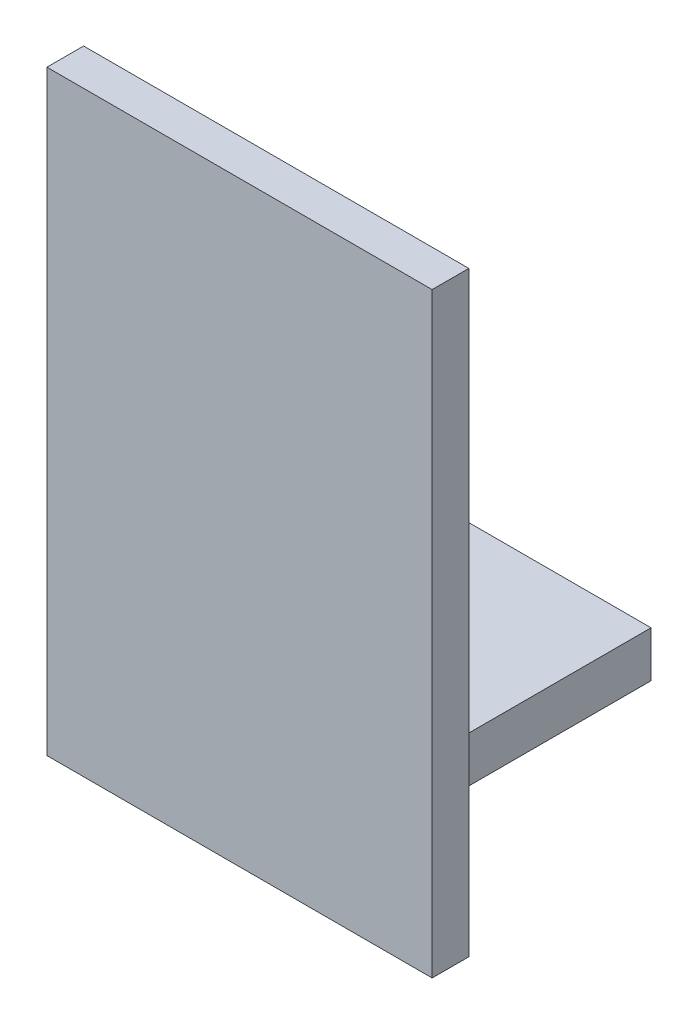
ISO-10303-21;
HEADER;
FILE_DESCRIPTION(('STEP AP214'),'2;1');
FILE_NAME('part.step','',(''),(''),'','','');
FILE_SCHEMA(('AUTOMOTIVE_DESIGN { 1 0 10303 214 1 1 1 1 }'));
ENDSEC;
DATA;
#1=APPLICATION_CONTEXT('core data for automotive mechanical design processes');
#2=APPLICATION_PROTOCOL_DEFINITION('international standard','automotive_design',2000,#1);
#3=PRODUCT_CONTEXT('',#1,'mechanical');
#4=PRODUCT('Part','Part','',(#3));
#5=PRODUCT_RELATED_PRODUCT_CATEGORY('part','',(#4));
#6=PRODUCT_DEFINITION_FORMATION('','',#4);
#7=PRODUCT_DEFINITION_CONTEXT('part definition',#1,'design');
#8=PRODUCT_DEFINITION('design','',#6,#7);
#9=PRODUCT_DEFINITION_SHAPE('','',#8);
#10=(LENGTH_UNIT() NAMED_UNIT(*) SI_UNIT(.MILLI.,.METRE.));
#11=(NAMED_UNIT(*) PLANE_ANGLE_UNIT() SI_UNIT($,.RADIAN.));
#12=(NAMED_UNIT(*) SI_UNIT($,.STERADIAN.) SOLID_ANGLE_UNIT());
#13=UNCERTAINTY_MEASURE_WITH_UNIT(LENGTH_MEASURE(1.E-05),#10,'distance_accuracy_value','');
#14=(GEOMETRIC_REPRESENTATION_CONTEXT(3) GLOBAL_UNCERTAINTY_ASSIGNED_CONTEXT((#13)) GLOBAL_UNIT_ASSIGNED_CONTEXT((#10,
#11,#12)) REPRESENTATION_CONTEXT('',''));
#15=CARTESIAN_POINT('',(0.,0.,0.));
#16=DIRECTION('',(0.,0.,1.));
#17=DIRECTION('',(1.,0.,0.));
#18=AXIS2_PLACEMENT_3D('',#15,#16,#17);
#19=CARTESIAN_POINT('',(-42.,0.,0.));
#20=DIRECTION('',(0.,1.,0.));
#21=DIRECTION('',(0.,0.,1.));
#22=AXIS2_PLACEMENT_3D('',#19,#20,#21);
#23=PLANE('',#22);
#24=DIRECTION('',(0.,0.,1.));
#25=VECTOR('',#24,1.);
#26=CARTESIAN_POINT('',(-16.132543853731,0.,-36.3744901061168));
#27=LINE('',#26,#25);
#28=CARTESIAN_POINT('',(-16.132543853731,0.,-36.));
#29=VERTEX_POINT('',#28);
#30=CARTESIAN_POINT('',(-16.132543853731,0.,0.));
#31=VERTEX_POINT('',#30);
#32=EDGE_CURVE('E132',#29,#31,#27,.T.);
#33=ORIENTED_EDGE('',*,*,#32,.F.);
#34=DIRECTION('',(1.,0.,0.));
#35=VECTOR('',#34,1.);
#36=CARTESIAN_POINT('',(-42.,0.,-36.));
#37=LINE('',#36,#35);
#38=CARTESIAN_POINT('',(-42.,0.,-36.));
#39=VERTEX_POINT('',#38);
#40=EDGE_CURVE('E11',#39,#29,#37,.T.);
#41=ORIENTED_EDGE('',*,*,#40,.F.);
#42=DIRECTION('',(0.,0.,1.));
#43=VECTOR('',#42,1.);
#44=CARTESIAN_POINT('',(-42.,0.,0.));
#45=LINE('',#44,#43);
#46=CARTESIAN_POINT('',(-42.,0.,0.));
#47=VERTEX_POINT('',#46);
#48=EDGE_CURVE('E124',#39,#47,#45,.T.);
#49=ORIENTED_EDGE('',*,*,#48,.T.);
#50=DIRECTION('',(1.,0.,0.));
#51=VECTOR('',#50,1.);
#52=CARTESIAN_POINT('',(-42.,0.,0.));
#53=LINE('',#52,#51);
#54=EDGE_CURVE('E35',#47,#31,#53,.T.);
#55=ORIENTED_EDGE('',*,*,#54,.T.);
#56=EDGE_LOOP('',(#33,#41,#49,#55));
#57=FACE_BOUND('',#56,.T.);
#58=ADVANCED_FACE('F32',(#57),#23,.T.);
#59=CARTESIAN_POINT('',(-42.,0.,-36.));
#60=DIRECTION('',(0.,0.,-1.));
#61=DIRECTION('',(-1.,0.,0.));
#62=AXIS2_PLACEMENT_3D('',#59,#60,#61);
#63=PLANE('',#62);
#64=DIRECTION('',(0.,1.,0.));
#65=VECTOR('',#64,1.);
#66=CARTESIAN_POINT('',(-16.132543853731,0.,-36.));
#67=LINE('',#66,#65);
#68=CARTESIAN_POINT('',(-16.132543853731,-5.,-36.));
#69=VERTEX_POINT('',#68);
#70=EDGE_CURVE('E119',#69,#29,#67,.T.);
#71=ORIENTED_EDGE('',*,*,#70,.F.);
#72=DIRECTION('',(1.,0.,0.));
#73=VECTOR('',#72,1.);
#74=CARTESIAN_POINT('',(-42.,-5.,-36.));
#75=LINE('',#74,#73);
#76=CARTESIAN_POINT('',(-42.,-5.,-36.));
#77=VERTEX_POINT('',#76);
#78=EDGE_CURVE('E41',#77,#69,#75,.T.);
#79=ORIENTED_EDGE('',*,*,#78,.F.);
#80=DIRECTION('',(0.,1.,0.));
#81=VECTOR('',#80,1.);
#82=CARTESIAN_POINT('',(-42.,0.,-36.));
#83=LINE('',#82,#81);
#84=EDGE_CURVE('E105',#77,#39,#83,.T.);
#85=ORIENTED_EDGE('',*,*,#84,.T.);
#86=ORIENTED_EDGE('',*,*,#40,.T.);
#87=EDGE_LOOP('',(#71,#79,#85,#86));
#88=FACE_BOUND('',#87,.T.);
#89=ADVANCED_FACE('F160',(#88),#63,.T.);
#90=CARTESIAN_POINT('',(-42.,-5.,-36.));
#91=DIRECTION('',(0.,-1.,0.));
#92=DIRECTION('',(0.,0.,-1.));
#93=AXIS2_PLACEMENT_3D('',#90,#91,#92);
#94=PLANE('',#93);
#95=DIRECTION('',(1.,0.,0.));
#96=VECTOR('',#95,1.);
#97=CARTESIAN_POINT('',(-16.132543853731,-5.,0.));
#98=LINE('',#97,#96);
#99=CARTESIAN_POINT('',(-16.132543853731,-5.,0.));
#100=VERTEX_POINT('',#99);
#101=CARTESIAN_POINT('',(0.,-5.,0.));
#102=VERTEX_POINT('',#101);
#103=EDGE_CURVE('E145',#100,#102,#98,.T.);
#104=ORIENTED_EDGE('',*,*,#103,.T.);
#105=DIRECTION('',(0.,0.,-1.));
#106=VECTOR('',#105,1.);
#107=CARTESIAN_POINT('',(0.,-5.,-36.));
#108=LINE('',#107,#106);
#109=CARTESIAN_POINT('',(0.,-5.,4.));
#110=VERTEX_POINT('',#109);
#111=EDGE_CURVE('E96',#110,#102,#108,.T.);
#112=ORIENTED_EDGE('',*,*,#111,.F.);
#113=DIRECTION('',(1.,0.,0.));
#114=VECTOR('',#113,1.);
#115=CARTESIAN_POINT('',(-42.,-5.,4.));
#116=LINE('',#115,#114);
#117=CARTESIAN_POINT('',(-42.,-5.,4.));
#118=VERTEX_POINT('',#117);
#119=EDGE_CURVE('E71',#118,#110,#116,.T.);
#120=ORIENTED_EDGE('',*,*,#119,.F.);
#121=DIRECTION('',(0.,0.,-1.));
#122=VECTOR('',#121,1.);
#123=CARTESIAN_POINT('',(-42.,-5.,-36.));
#124=LINE('',#123,#122);
#125=EDGE_CURVE('E93',#118,#77,#124,.T.);
#126=ORIENTED_EDGE('',*,*,#125,.T.);
#127=ORIENTED_EDGE('',*,*,#78,.T.);
#128=DIRECTION('',(0.,0.,1.));
#129=VECTOR('',#128,1.);
#130=CARTESIAN_POINT('',(-16.132543853731,-5.,-36.3744901061168));
#131=LINE('',#130,#129);
#132=EDGE_CURVE('E148',#69,#100,#131,.T.);
#133=ORIENTED_EDGE('',*,*,#132,.T.);
#134=EDGE_LOOP('',(#104,#112,#120,#126,#127,#133));
#135=FACE_BOUND('',#134,.T.);
#136=ADVANCED_FACE('F91',(#135),#94,.T.);
#137=CARTESIAN_POINT('',(-42.,-5.,4.));
#138=DIRECTION('',(0.,0.,1.));
#139=DIRECTION('',(0.,-1.,0.));
#140=AXIS2_PLACEMENT_3D('',#137,#138,#139);
#141=PLANE('',#140);
#142=DIRECTION('',(0.,-1.,0.));
#143=VECTOR('',#142,1.);
#144=CARTESIAN_POINT('',(0.,-5.,4.));
#145=LINE('',#144,#143);
#146=CARTESIAN_POINT('',(0.,60.,4.));
#147=VERTEX_POINT('',#146);
#148=EDGE_CURVE('E122',#147,#110,#145,.T.);
#149=ORIENTED_EDGE('',*,*,#148,.F.);
#150=DIRECTION('',(1.,0.,0.));
#151=VECTOR('',#150,1.);
#152=CARTESIAN_POINT('',(-42.,60.,4.));
#153=LINE('',#152,#151);
#154=CARTESIAN_POINT('',(-42.,60.,4.));
#155=VERTEX_POINT('',#154);
#156=EDGE_CURVE('E64',#155,#147,#153,.T.);
#157=ORIENTED_EDGE('',*,*,#156,.F.);
#158=DIRECTION('',(0.,-1.,0.));
#159=VECTOR('',#158,1.);
#160=CARTESIAN_POINT('',(-42.,-5.,4.));
#161=LINE('',#160,#159);
#162=EDGE_CURVE('E103',#155,#118,#161,.T.);
#163=ORIENTED_EDGE('',*,*,#162,.T.);
#164=ORIENTED_EDGE('',*,*,#119,.T.);
#165=EDGE_LOOP('',(#149,#157,#163,#164));
#166=FACE_BOUND('',#165,.T.);
#167=ADVANCED_FACE('F107',(#166),#141,.T.);
#168=CARTESIAN_POINT('',(-42.,60.,4.));
#169=DIRECTION('',(0.,1.,0.));
#170=DIRECTION('',(0.,0.,1.));
#171=AXIS2_PLACEMENT_3D('',#168,#169,#170);
#172=PLANE('',#171);
#173=DIRECTION('',(0.,0.,1.));
#174=VECTOR('',#173,1.);
#175=CARTESIAN_POINT('',(0.,60.,4.));
#176=LINE('',#175,#174);
#177=CARTESIAN_POINT('',(0.,60.,0.));
#178=VERTEX_POINT('',#177);
#179=EDGE_CURVE('E118',#178,#147,#176,.T.);
#180=ORIENTED_EDGE('',*,*,#179,.F.);
#181=DIRECTION('',(1.,0.,0.));
#182=VECTOR('',#181,1.);
#183=CARTESIAN_POINT('',(-42.,60.,0.));
#184=LINE('',#183,#182);
#185=CARTESIAN_POINT('',(-42.,60.,0.));
#186=VERTEX_POINT('',#185);
#187=EDGE_CURVE('E127',#186,#178,#184,.T.);
#188=ORIENTED_EDGE('',*,*,#187,.F.);
#189=DIRECTION('',(0.,0.,1.));
#190=VECTOR('',#189,1.);
#191=CARTESIAN_POINT('',(-42.,60.,4.));
#192=LINE('',#191,#190);
#193=EDGE_CURVE('E108',#186,#155,#192,.T.);
#194=ORIENTED_EDGE('',*,*,#193,.T.);
#195=ORIENTED_EDGE('',*,*,#156,.T.);
#196=EDGE_LOOP('',(#180,#188,#194,#195));
#197=FACE_BOUND('',#196,.T.);
#198=ADVANCED_FACE('F152',(#197),#172,.T.);
#199=CARTESIAN_POINT('',(-42.,0.,0.));
#200=DIRECTION('',(0.,0.,-1.));
#201=DIRECTION('',(-1.,0.,0.));
#202=AXIS2_PLACEMENT_3D('',#199,#200,#201);
#203=PLANE('',#202);
#204=DIRECTION('',(0.,1.,0.));
#205=VECTOR('',#204,1.);
#206=CARTESIAN_POINT('',(0.,0.,0.));
#207=LINE('',#206,#205);
#208=EDGE_CURVE('E115',#102,#178,#207,.T.);
#209=ORIENTED_EDGE('',*,*,#208,.F.);
#210=ORIENTED_EDGE('',*,*,#103,.F.);
#211=DIRECTION('',(0.,1.,0.));
#212=VECTOR('',#211,1.);
#213=CARTESIAN_POINT('',(-16.132543853731,-5.,0.));
#214=LINE('',#213,#212);
#215=EDGE_CURVE('E149',#100,#31,#214,.T.);
#216=ORIENTED_EDGE('',*,*,#215,.T.);
#217=ORIENTED_EDGE('',*,*,#54,.F.);
#218=DIRECTION('',(0.,1.,0.));
#219=VECTOR('',#218,1.);
#220=CARTESIAN_POINT('',(-42.,0.,0.));
#221=LINE('',#220,#219);
#222=EDGE_CURVE('E110',#47,#186,#221,.T.);
#223=ORIENTED_EDGE('',*,*,#222,.T.);
#224=ORIENTED_EDGE('',*,*,#187,.T.);
#225=EDGE_LOOP('',(#209,#210,#216,#217,#223,#224));
#226=FACE_BOUND('',#225,.T.);
#227=ADVANCED_FACE('F144',(#226),#203,.T.);
#228=CARTESIAN_POINT('',(-42.,0.,-36.));
#229=DIRECTION('',(-1.,0.,0.));
#230=DIRECTION('',(0.,0.,1.));
#231=AXIS2_PLACEMENT_3D('',#228,#229,#230);
#232=PLANE('',#231);
#233=ORIENTED_EDGE('',*,*,#48,.F.);
#234=ORIENTED_EDGE('',*,*,#84,.F.);
#235=ORIENTED_EDGE('',*,*,#125,.F.);
#236=ORIENTED_EDGE('',*,*,#162,.F.);
#237=ORIENTED_EDGE('',*,*,#193,.F.);
#238=ORIENTED_EDGE('',*,*,#222,.F.);
#239=EDGE_LOOP('',(#233,#234,#235,#236,#237,#238));
#240=FACE_BOUND('',#239,.T.);
#241=ADVANCED_FACE('F101',(#240),#232,.T.);
#242=CARTESIAN_POINT('',(0.,0.,-36.));
#243=DIRECTION('',(-1.,0.,0.));
#244=DIRECTION('',(0.,0.,1.));
#245=AXIS2_PLACEMENT_3D('',#242,#243,#244);
#246=PLANE('',#245);
#247=ORIENTED_EDGE('',*,*,#111,.T.);
#248=ORIENTED_EDGE('',*,*,#208,.T.);
#249=ORIENTED_EDGE('',*,*,#179,.T.);
#250=ORIENTED_EDGE('',*,*,#148,.T.);
#251=EDGE_LOOP('',(#247,#248,#249,#250));
#252=FACE_BOUND('',#251,.T.);
#253=ADVANCED_FACE('F151',(#252),#246,.F.);
#254=CARTESIAN_POINT('',(-16.132543853731,-5.,-36.3744901061168));
#255=DIRECTION('',(-1.,0.,0.));
#256=DIRECTION('',(0.,0.,1.));
#257=AXIS2_PLACEMENT_3D('',#254,#255,#256);
#258=PLANE('',#257);
#259=ORIENTED_EDGE('',*,*,#70,.T.);
#260=ORIENTED_EDGE('',*,*,#32,.T.);
#261=ORIENTED_EDGE('',*,*,#215,.F.);
#262=ORIENTED_EDGE('',*,*,#132,.F.);
#263=EDGE_LOOP('',(#259,#260,#261,#262));
#264=FACE_BOUND('',#263,.T.);
#265=ADVANCED_FACE('F158',(#264),#258,.F.);
#266=CLOSED_SHELL('',(#58,#89,#136,#167,#198,#227,#241,#253,#265));
#267=MANIFOLD_SOLID_BREP('B2',#266);
#268=ADVANCED_BREP_SHAPE_REPRESENTATION('',(#18,#267),#14);
#269=SHAPE_DEFINITION_REPRESENTATION(#9,#268);
ENDSEC;
END-ISO-10303-21;
